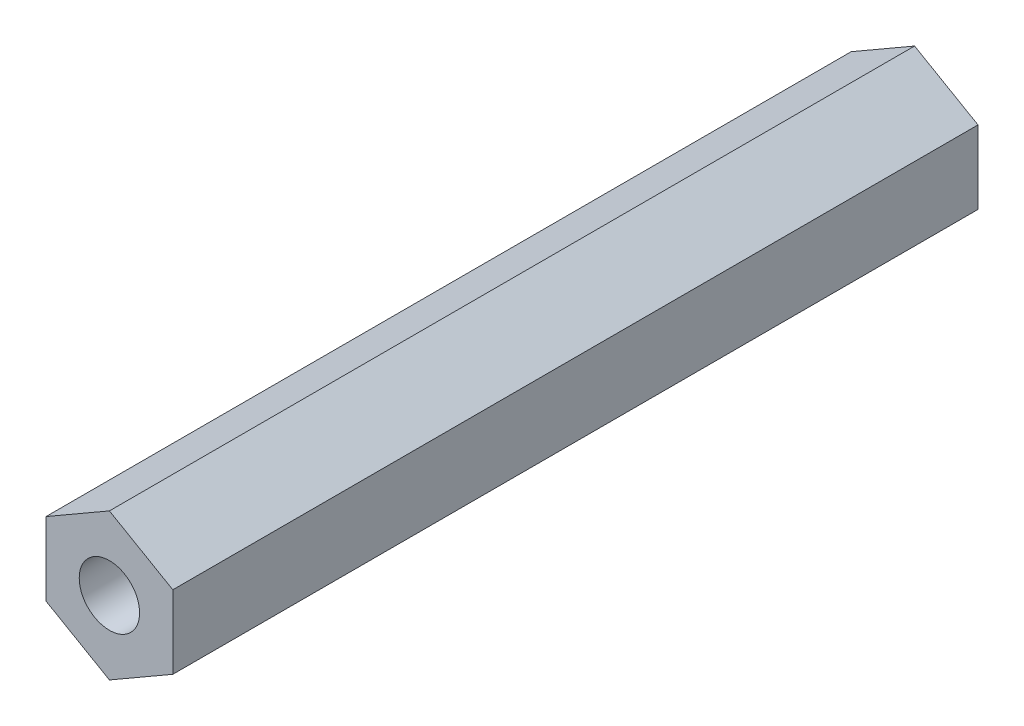
ISO-10303-21;
HEADER;
FILE_DESCRIPTION(('STEP AP214'),'2;1');
FILE_NAME('part.step','',(''),(''),'','','');
FILE_SCHEMA(('AUTOMOTIVE_DESIGN { 1 0 10303 214 1 1 1 1 }'));
ENDSEC;
DATA;
#1=APPLICATION_CONTEXT('core data for automotive mechanical design processes');
#2=APPLICATION_PROTOCOL_DEFINITION('international standard','automotive_design',2000,#1);
#3=PRODUCT_CONTEXT('',#1,'mechanical');
#4=PRODUCT('Part','Part','',(#3));
#5=PRODUCT_RELATED_PRODUCT_CATEGORY('part','',(#4));
#6=PRODUCT_DEFINITION_FORMATION('','',#4);
#7=PRODUCT_DEFINITION_CONTEXT('part definition',#1,'design');
#8=PRODUCT_DEFINITION('design','',#6,#7);
#9=PRODUCT_DEFINITION_SHAPE('','',#8);
#10=(LENGTH_UNIT() NAMED_UNIT(*) SI_UNIT(.MILLI.,.METRE.));
#11=(NAMED_UNIT(*) PLANE_ANGLE_UNIT() SI_UNIT($,.RADIAN.));
#12=(NAMED_UNIT(*) SI_UNIT($,.STERADIAN.) SOLID_ANGLE_UNIT());
#13=UNCERTAINTY_MEASURE_WITH_UNIT(LENGTH_MEASURE(1.E-05),#10,'distance_accuracy_value','');
#14=(GEOMETRIC_REPRESENTATION_CONTEXT(3) GLOBAL_UNCERTAINTY_ASSIGNED_CONTEXT((#13)) GLOBAL_UNIT_ASSIGNED_CONTEXT((#10,
#11,#12)) REPRESENTATION_CONTEXT('',''));
#15=CARTESIAN_POINT('',(0.,0.,0.));
#16=DIRECTION('',(0.,0.,1.));
#17=DIRECTION('',(1.,0.,0.));
#18=AXIS2_PLACEMENT_3D('',#15,#16,#17);
#19=CARTESIAN_POINT('',(0.,2.90984535671571,32.));
#20=DIRECTION('',(0.5,-0.866025403784439,0.));
#21=DIRECTION('',(0.866025403784439,0.5,0.));
#22=AXIS2_PLACEMENT_3D('',#19,#20,#21);
#23=PLANE('',#22);
#24=DIRECTION('',(-0.866025403784439,-0.5,0.));
#25=VECTOR('',#24,1.);
#26=CARTESIAN_POINT('',(0.,2.90984535671571,0.));
#27=LINE('',#26,#25);
#28=CARTESIAN_POINT('',(0.,2.90984535671571,0.));
#29=VERTEX_POINT('',#28);
#30=CARTESIAN_POINT('',(-2.52,1.45492267835786,0.));
#31=VERTEX_POINT('',#30);
#32=EDGE_CURVE('E121',#29,#31,#27,.T.);
#33=ORIENTED_EDGE('',*,*,#32,.T.);
#34=DIRECTION('',(0.,0.,-1.));
#35=VECTOR('',#34,1.);
#36=CARTESIAN_POINT('',(-2.52,1.45492267835786,32.));
#37=LINE('',#36,#35);
#38=CARTESIAN_POINT('',(-2.52,1.45492267835786,32.));
#39=VERTEX_POINT('',#38);
#40=EDGE_CURVE('E11',#39,#31,#37,.T.);
#41=ORIENTED_EDGE('',*,*,#40,.F.);
#42=DIRECTION('',(-0.866025403784439,-0.5,0.));
#43=VECTOR('',#42,1.);
#44=CARTESIAN_POINT('',(0.,2.90984535671571,32.));
#45=LINE('',#44,#43);
#46=CARTESIAN_POINT('',(0.,2.90984535671571,32.));
#47=VERTEX_POINT('',#46);
#48=EDGE_CURVE('E132',#47,#39,#45,.T.);
#49=ORIENTED_EDGE('',*,*,#48,.F.);
#50=DIRECTION('',(0.,0.,-1.));
#51=VECTOR('',#50,1.);
#52=CARTESIAN_POINT('',(0.,2.90984535671571,32.));
#53=LINE('',#52,#51);
#54=EDGE_CURVE('E117',#47,#29,#53,.T.);
#55=ORIENTED_EDGE('',*,*,#54,.T.);
#56=EDGE_LOOP('',(#33,#41,#49,#55));
#57=FACE_BOUND('',#56,.T.);
#58=ADVANCED_FACE('F37',(#57),#23,.F.);
#59=CARTESIAN_POINT('',(-2.52,1.45492267835786,32.));
#60=DIRECTION('',(1.,0.,0.));
#61=DIRECTION('',(0.,1.,0.));
#62=AXIS2_PLACEMENT_3D('',#59,#60,#61);
#63=PLANE('',#62);
#64=DIRECTION('',(0.,-1.,0.));
#65=VECTOR('',#64,1.);
#66=CARTESIAN_POINT('',(-2.52,1.45492267835786,0.));
#67=LINE('',#66,#65);
#68=CARTESIAN_POINT('',(-2.52,-1.45492267835786,0.));
#69=VERTEX_POINT('',#68);
#70=EDGE_CURVE('E124',#31,#69,#67,.T.);
#71=ORIENTED_EDGE('',*,*,#70,.T.);
#72=DIRECTION('',(0.,0.,-1.));
#73=VECTOR('',#72,1.);
#74=CARTESIAN_POINT('',(-2.52,-1.45492267835786,32.));
#75=LINE('',#74,#73);
#76=CARTESIAN_POINT('',(-2.52,-1.45492267835786,32.));
#77=VERTEX_POINT('',#76);
#78=EDGE_CURVE('E45',#77,#69,#75,.T.);
#79=ORIENTED_EDGE('',*,*,#78,.F.);
#80=DIRECTION('',(0.,-1.,0.));
#81=VECTOR('',#80,1.);
#82=CARTESIAN_POINT('',(-2.52,1.45492267835786,32.));
#83=LINE('',#82,#81);
#84=EDGE_CURVE('E90',#39,#77,#83,.T.);
#85=ORIENTED_EDGE('',*,*,#84,.F.);
#86=ORIENTED_EDGE('',*,*,#40,.T.);
#87=EDGE_LOOP('',(#71,#79,#85,#86));
#88=FACE_BOUND('',#87,.T.);
#89=ADVANCED_FACE('F157',(#88),#63,.F.);
#90=CARTESIAN_POINT('',(-2.52,-1.45492267835786,32.));
#91=DIRECTION('',(0.5,0.866025403784439,0.));
#92=DIRECTION('',(-0.866025403784439,0.5,0.));
#93=AXIS2_PLACEMENT_3D('',#90,#91,#92);
#94=PLANE('',#93);
#95=DIRECTION('',(0.866025403784439,-0.5,0.));
#96=VECTOR('',#95,1.);
#97=CARTESIAN_POINT('',(-2.52,-1.45492267835786,0.));
#98=LINE('',#97,#96);
#99=CARTESIAN_POINT('',(0.,-2.90984535671571,0.));
#100=VERTEX_POINT('',#99);
#101=EDGE_CURVE('E127',#69,#100,#98,.T.);
#102=ORIENTED_EDGE('',*,*,#101,.T.);
#103=DIRECTION('',(0.,0.,-1.));
#104=VECTOR('',#103,1.);
#105=CARTESIAN_POINT('',(0.,-2.90984535671571,32.));
#106=LINE('',#105,#104);
#107=CARTESIAN_POINT('',(0.,-2.90984535671571,32.));
#108=VERTEX_POINT('',#107);
#109=EDGE_CURVE('E112',#108,#100,#106,.T.);
#110=ORIENTED_EDGE('',*,*,#109,.F.);
#111=DIRECTION('',(0.866025403784439,-0.5,0.));
#112=VECTOR('',#111,1.);
#113=CARTESIAN_POINT('',(-2.52,-1.45492267835786,32.));
#114=LINE('',#113,#112);
#115=EDGE_CURVE('E103',#77,#108,#114,.T.);
#116=ORIENTED_EDGE('',*,*,#115,.F.);
#117=ORIENTED_EDGE('',*,*,#78,.T.);
#118=EDGE_LOOP('',(#102,#110,#116,#117));
#119=FACE_BOUND('',#118,.T.);
#120=ADVANCED_FACE('F138',(#119),#94,.F.);
#121=CARTESIAN_POINT('',(0.,-2.90984535671571,32.));
#122=DIRECTION('',(-0.5,0.866025403784439,0.));
#123=DIRECTION('',(-0.866025403784439,-0.5,0.));
#124=AXIS2_PLACEMENT_3D('',#121,#122,#123);
#125=PLANE('',#124);
#126=DIRECTION('',(0.866025403784439,0.5,0.));
#127=VECTOR('',#126,1.);
#128=CARTESIAN_POINT('',(0.,-2.90984535671571,0.));
#129=LINE('',#128,#127);
#130=CARTESIAN_POINT('',(2.52,-1.45492267835786,0.));
#131=VERTEX_POINT('',#130);
#132=EDGE_CURVE('E111',#100,#131,#129,.T.);
#133=ORIENTED_EDGE('',*,*,#132,.T.);
#134=DIRECTION('',(0.,0.,-1.));
#135=VECTOR('',#134,1.);
#136=CARTESIAN_POINT('',(2.52,-1.45492267835786,32.));
#137=LINE('',#136,#135);
#138=CARTESIAN_POINT('',(2.52,-1.45492267835786,32.));
#139=VERTEX_POINT('',#138);
#140=EDGE_CURVE('E108',#139,#131,#137,.T.);
#141=ORIENTED_EDGE('',*,*,#140,.F.);
#142=DIRECTION('',(0.866025403784439,0.5,0.));
#143=VECTOR('',#142,1.);
#144=CARTESIAN_POINT('',(0.,-2.90984535671571,32.));
#145=LINE('',#144,#143);
#146=EDGE_CURVE('E97',#108,#139,#145,.T.);
#147=ORIENTED_EDGE('',*,*,#146,.F.);
#148=ORIENTED_EDGE('',*,*,#109,.T.);
#149=EDGE_LOOP('',(#133,#141,#147,#148));
#150=FACE_BOUND('',#149,.T.);
#151=ADVANCED_FACE('F109',(#150),#125,.F.);
#152=CARTESIAN_POINT('',(2.52,-1.45492267835786,32.));
#153=DIRECTION('',(-1.,0.,0.));
#154=DIRECTION('',(0.,-1.,0.));
#155=AXIS2_PLACEMENT_3D('',#152,#153,#154);
#156=PLANE('',#155);
#157=DIRECTION('',(0.,1.,0.));
#158=VECTOR('',#157,1.);
#159=CARTESIAN_POINT('',(2.52,-1.45492267835786,0.));
#160=LINE('',#159,#158);
#161=CARTESIAN_POINT('',(2.52,1.45492267835786,0.));
#162=VERTEX_POINT('',#161);
#163=EDGE_CURVE('E76',#131,#162,#160,.T.);
#164=ORIENTED_EDGE('',*,*,#163,.T.);
#165=DIRECTION('',(0.,0.,-1.));
#166=VECTOR('',#165,1.);
#167=CARTESIAN_POINT('',(2.52,1.45492267835786,32.));
#168=LINE('',#167,#166);
#169=CARTESIAN_POINT('',(2.52,1.45492267835786,32.));
#170=VERTEX_POINT('',#169);
#171=EDGE_CURVE('E113',#170,#162,#168,.T.);
#172=ORIENTED_EDGE('',*,*,#171,.F.);
#173=DIRECTION('',(0.,1.,0.));
#174=VECTOR('',#173,1.);
#175=CARTESIAN_POINT('',(2.52,-1.45492267835786,32.));
#176=LINE('',#175,#174);
#177=EDGE_CURVE('E101',#139,#170,#176,.T.);
#178=ORIENTED_EDGE('',*,*,#177,.F.);
#179=ORIENTED_EDGE('',*,*,#140,.T.);
#180=EDGE_LOOP('',(#164,#172,#178,#179));
#181=FACE_BOUND('',#180,.T.);
#182=ADVANCED_FACE('F115',(#181),#156,.F.);
#183=CARTESIAN_POINT('',(2.52,1.45492267835786,32.));
#184=DIRECTION('',(-0.5,-0.866025403784439,0.));
#185=DIRECTION('',(0.866025403784439,-0.5,0.));
#186=AXIS2_PLACEMENT_3D('',#183,#184,#185);
#187=PLANE('',#186);
#188=DIRECTION('',(-0.866025403784439,0.5,0.));
#189=VECTOR('',#188,1.);
#190=CARTESIAN_POINT('',(2.52,1.45492267835786,0.));
#191=LINE('',#190,#189);
#192=EDGE_CURVE('E82',#162,#29,#191,.T.);
#193=ORIENTED_EDGE('',*,*,#192,.T.);
#194=ORIENTED_EDGE('',*,*,#54,.F.);
#195=DIRECTION('',(-0.866025403784439,0.5,0.));
#196=VECTOR('',#195,1.);
#197=CARTESIAN_POINT('',(2.52,1.45492267835786,32.));
#198=LINE('',#197,#196);
#199=EDGE_CURVE('E53',#170,#47,#198,.T.);
#200=ORIENTED_EDGE('',*,*,#199,.F.);
#201=ORIENTED_EDGE('',*,*,#171,.T.);
#202=EDGE_LOOP('',(#193,#194,#200,#201));
#203=FACE_BOUND('',#202,.T.);
#204=ADVANCED_FACE('F145',(#203),#187,.F.);
#205=CARTESIAN_POINT('',(0.,0.,32.));
#206=DIRECTION('',(0.,0.,1.));
#207=DIRECTION('',(1.,0.,0.));
#208=AXIS2_PLACEMENT_3D('',#205,#206,#207);
#209=PLANE('',#208);
#210=CARTESIAN_POINT('',(0.,0.,32.));
#211=DIRECTION('',(0.,0.,-1.));
#212=DIRECTION('',(-1.,0.,0.));
#213=AXIS2_PLACEMENT_3D('',#210,#211,#212);
#214=CIRCLE('',#213,1.2);
#215=CARTESIAN_POINT('',(-1.2,0.,32.));
#216=VERTEX_POINT('',#215);
#217=EDGE_CURVE('E125',#216,#216,#214,.T.);
#218=ORIENTED_EDGE('',*,*,#217,.T.);
#219=EDGE_LOOP('',(#218));
#220=FACE_BOUND('',#219,.T.);
#221=ORIENTED_EDGE('',*,*,#48,.T.);
#222=ORIENTED_EDGE('',*,*,#84,.T.);
#223=ORIENTED_EDGE('',*,*,#115,.T.);
#224=ORIENTED_EDGE('',*,*,#146,.T.);
#225=ORIENTED_EDGE('',*,*,#177,.T.);
#226=ORIENTED_EDGE('',*,*,#199,.T.);
#227=EDGE_LOOP('',(#221,#222,#223,#224,#225,#226));
#228=FACE_BOUND('',#227,.T.);
#229=ADVANCED_FACE('F99',(#220,#228),#209,.T.);
#230=CARTESIAN_POINT('',(0.,0.,0.));
#231=DIRECTION('',(0.,0.,1.));
#232=DIRECTION('',(1.,0.,0.));
#233=AXIS2_PLACEMENT_3D('',#230,#231,#232);
#234=PLANE('',#233);
#235=CARTESIAN_POINT('',(0.,0.,0.));
#236=DIRECTION('',(0.,0.,-1.));
#237=DIRECTION('',(-1.,0.,0.));
#238=AXIS2_PLACEMENT_3D('',#235,#236,#237);
#239=CIRCLE('',#238,1.2);
#240=CARTESIAN_POINT('',(-1.2,0.,0.));
#241=VERTEX_POINT('',#240);
#242=EDGE_CURVE('E212',#241,#241,#239,.T.);
#243=ORIENTED_EDGE('',*,*,#242,.F.);
#244=EDGE_LOOP('',(#243));
#245=FACE_BOUND('',#244,.T.);
#246=ORIENTED_EDGE('',*,*,#32,.F.);
#247=ORIENTED_EDGE('',*,*,#192,.F.);
#248=ORIENTED_EDGE('',*,*,#163,.F.);
#249=ORIENTED_EDGE('',*,*,#132,.F.);
#250=ORIENTED_EDGE('',*,*,#101,.F.);
#251=ORIENTED_EDGE('',*,*,#70,.F.);
#252=EDGE_LOOP('',(#246,#247,#248,#249,#250,#251));
#253=FACE_BOUND('',#252,.T.);
#254=ADVANCED_FACE('F141',(#245,#253),#234,.F.);
#255=CARTESIAN_POINT('',(0.,0.,32.));
#256=DIRECTION('',(0.,0.,-1.));
#257=DIRECTION('',(-1.,0.,0.));
#258=AXIS2_PLACEMENT_3D('',#255,#256,#257);
#259=CYLINDRICAL_SURFACE('',#258,1.2);
#260=ORIENTED_EDGE('',*,*,#217,.F.);
#261=EDGE_LOOP('',(#260));
#262=FACE_BOUND('',#261,.T.);
#263=ORIENTED_EDGE('',*,*,#242,.T.);
#264=EDGE_LOOP('',(#263));
#265=FACE_BOUND('',#264,.T.);
#266=ADVANCED_FACE('F194',(#262,#265),#259,.F.);
#267=CLOSED_SHELL('',(#58,#89,#120,#151,#182,#204,#229,#254,#266));
#268=MANIFOLD_SOLID_BREP('B2',#267);
#269=ADVANCED_BREP_SHAPE_REPRESENTATION('',(#18,#268),#14);
#270=SHAPE_DEFINITION_REPRESENTATION(#9,#269);
ENDSEC;
END-ISO-10303-21;
